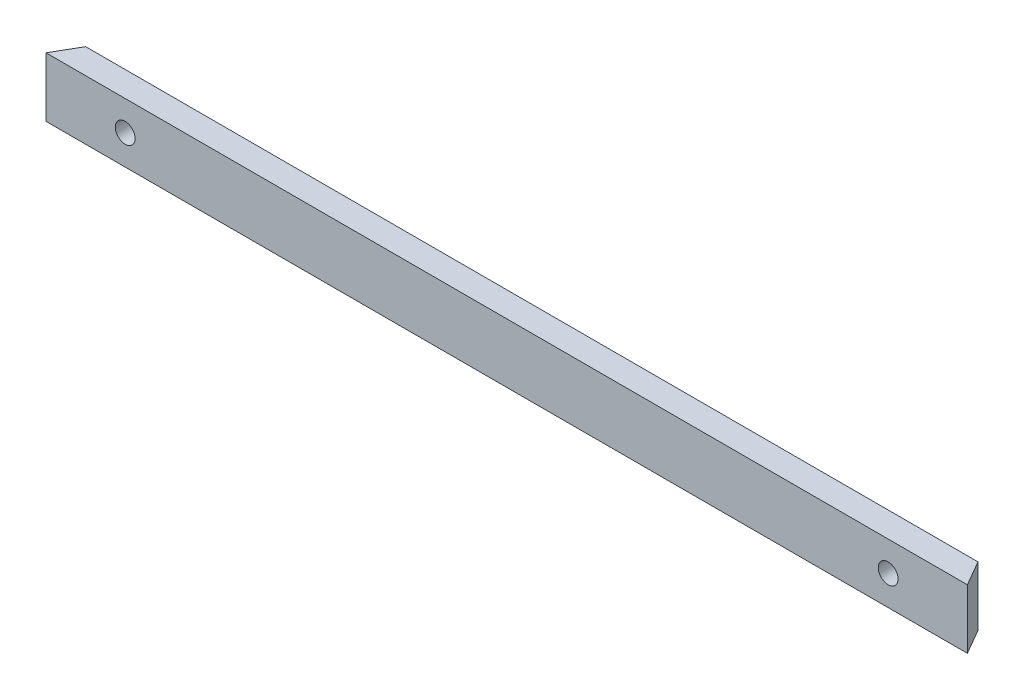
ISO-10303-21;
HEADER;
FILE_DESCRIPTION(('STEP AP214'),'2;1');
FILE_NAME('part.step','',(''),(''),'','','');
FILE_SCHEMA(('AUTOMOTIVE_DESIGN { 1 0 10303 214 1 1 1 1 }'));
ENDSEC;
DATA;
#1=APPLICATION_CONTEXT('core data for automotive mechanical design processes');
#2=APPLICATION_PROTOCOL_DEFINITION('international standard','automotive_design',2000,#1);
#3=PRODUCT_CONTEXT('',#1,'mechanical');
#4=PRODUCT('Part','Part','',(#3));
#5=PRODUCT_RELATED_PRODUCT_CATEGORY('part','',(#4));
#6=PRODUCT_DEFINITION_FORMATION('','',#4);
#7=PRODUCT_DEFINITION_CONTEXT('part definition',#1,'design');
#8=PRODUCT_DEFINITION('design','',#6,#7);
#9=PRODUCT_DEFINITION_SHAPE('','',#8);
#10=(LENGTH_UNIT() NAMED_UNIT(*) SI_UNIT(.MILLI.,.METRE.));
#11=(NAMED_UNIT(*) PLANE_ANGLE_UNIT() SI_UNIT($,.RADIAN.));
#12=(NAMED_UNIT(*) SI_UNIT($,.STERADIAN.) SOLID_ANGLE_UNIT());
#13=UNCERTAINTY_MEASURE_WITH_UNIT(LENGTH_MEASURE(1.E-05),#10,'distance_accuracy_value','');
#14=(GEOMETRIC_REPRESENTATION_CONTEXT(3) GLOBAL_UNCERTAINTY_ASSIGNED_CONTEXT((#13)) GLOBAL_UNIT_ASSIGNED_CONTEXT((#10,
#11,#12)) REPRESENTATION_CONTEXT('',''));
#15=CARTESIAN_POINT('',(0.,0.,0.));
#16=DIRECTION('',(0.,0.,1.));
#17=DIRECTION('',(1.,0.,0.));
#18=AXIS2_PLACEMENT_3D('',#15,#16,#17);
#19=CARTESIAN_POINT('',(0.,15.,-6.35));
#20=DIRECTION('',(0.,-1.,0.));
#21=DIRECTION('',(0.,0.,-1.));
#22=AXIS2_PLACEMENT_3D('',#19,#20,#21);
#23=PLANE('',#22);
#24=DIRECTION('',(1.,0.,0.));
#25=VECTOR('',#24,1.);
#26=CARTESIAN_POINT('',(0.,15.,-6.35));
#27=LINE('',#26,#25);
#28=CARTESIAN_POINT('',(3.6661742093541,15.,-6.35));
#29=VERTEX_POINT('',#28);
#30=CARTESIAN_POINT('',(229.001477390646,15.,-6.35));
#31=VERTEX_POINT('',#30);
#32=EDGE_CURVE('E50',#29,#31,#27,.T.);
#33=ORIENTED_EDGE('',*,*,#32,.F.);
#34=DIRECTION('',(0.499999999999998,0.,-0.86602540378444));
#35=VECTOR('',#34,1.);
#36=CARTESIAN_POINT('',(0.,15.,0.));
#37=LINE('',#36,#35);
#38=CARTESIAN_POINT('',(0.,15.,0.));
#39=VERTEX_POINT('',#38);
#40=EDGE_CURVE('E82',#39,#29,#37,.T.);
#41=ORIENTED_EDGE('',*,*,#40,.F.);
#42=DIRECTION('',(1.,0.,0.));
#43=VECTOR('',#42,1.);
#44=CARTESIAN_POINT('',(0.,15.,0.));
#45=LINE('',#44,#43);
#46=CARTESIAN_POINT('',(232.6676516,15.,0.));
#47=VERTEX_POINT('',#46);
#48=EDGE_CURVE('E105',#39,#47,#45,.T.);
#49=ORIENTED_EDGE('',*,*,#48,.T.);
#50=DIRECTION('',(0.499999999999996,0.,0.866025403784441));
#51=VECTOR('',#50,1.);
#52=CARTESIAN_POINT('',(232.6676516,15.,0.));
#53=LINE('',#52,#51);
#54=EDGE_CURVE('E66',#31,#47,#53,.T.);
#55=ORIENTED_EDGE('',*,*,#54,.F.);
#56=EDGE_LOOP('',(#33,#41,#49,#55));
#57=FACE_BOUND('',#56,.T.);
#58=ADVANCED_FACE('F42',(#57),#23,.F.);
#59=CARTESIAN_POINT('',(0.,0.,-6.35));
#60=DIRECTION('',(0.,-1.,0.));
#61=DIRECTION('',(0.,0.,-1.));
#62=AXIS2_PLACEMENT_3D('',#59,#60,#61);
#63=PLANE('',#62);
#64=DIRECTION('',(0.499999999999998,0.,-0.86602540378444));
#65=VECTOR('',#64,1.);
#66=CARTESIAN_POINT('',(0.,0.,0.));
#67=LINE('',#66,#65);
#68=CARTESIAN_POINT('',(0.,0.,0.));
#69=VERTEX_POINT('',#68);
#70=CARTESIAN_POINT('',(3.6661742093541,0.,-6.35));
#71=VERTEX_POINT('',#70);
#72=EDGE_CURVE('E58',#69,#71,#67,.T.);
#73=ORIENTED_EDGE('',*,*,#72,.T.);
#74=DIRECTION('',(1.,0.,0.));
#75=VECTOR('',#74,1.);
#76=CARTESIAN_POINT('',(0.,0.,-6.35));
#77=LINE('',#76,#75);
#78=CARTESIAN_POINT('',(229.001477390646,0.,-6.35));
#79=VERTEX_POINT('',#78);
#80=EDGE_CURVE('E11',#71,#79,#77,.T.);
#81=ORIENTED_EDGE('',*,*,#80,.T.);
#82=DIRECTION('',(0.499999999999996,0.,0.866025403784441));
#83=VECTOR('',#82,1.);
#84=CARTESIAN_POINT('',(232.6676516,0.,0.));
#85=LINE('',#84,#83);
#86=CARTESIAN_POINT('',(232.6676516,0.,0.));
#87=VERTEX_POINT('',#86);
#88=EDGE_CURVE('E101',#79,#87,#85,.T.);
#89=ORIENTED_EDGE('',*,*,#88,.T.);
#90=DIRECTION('',(1.,0.,0.));
#91=VECTOR('',#90,1.);
#92=CARTESIAN_POINT('',(0.,0.,0.));
#93=LINE('',#92,#91);
#94=EDGE_CURVE('E45',#69,#87,#93,.T.);
#95=ORIENTED_EDGE('',*,*,#94,.F.);
#96=EDGE_LOOP('',(#73,#81,#89,#95));
#97=FACE_BOUND('',#96,.T.);
#98=ADVANCED_FACE('F113',(#97),#63,.T.);
#99=CARTESIAN_POINT('',(0.,0.,-6.35));
#100=DIRECTION('',(0.,0.,-1.));
#101=DIRECTION('',(-1.,0.,0.));
#102=AXIS2_PLACEMENT_3D('',#99,#100,#101);
#103=PLANE('',#102);
#104=CARTESIAN_POINT('',(20.,7.5,-6.35));
#105=DIRECTION('',(0.,0.,1.));
#106=DIRECTION('',(1.,0.,0.));
#107=AXIS2_PLACEMENT_3D('',#104,#105,#106);
#108=CIRCLE('',#107,2.5);
#109=CARTESIAN_POINT('',(22.5,7.5,-6.35));
#110=VERTEX_POINT('',#109);
#111=EDGE_CURVE('E115',#110,#110,#108,.T.);
#112=ORIENTED_EDGE('',*,*,#111,.T.);
#113=EDGE_LOOP('',(#112));
#114=FACE_BOUND('',#113,.T.);
#115=CARTESIAN_POINT('',(212.6676516,7.5,-6.35));
#116=DIRECTION('',(0.,0.,1.));
#117=DIRECTION('',(1.,0.,0.));
#118=AXIS2_PLACEMENT_3D('',#115,#116,#117);
#119=CIRCLE('',#118,2.5);
#120=CARTESIAN_POINT('',(215.1676516,7.5,-6.35));
#121=VERTEX_POINT('',#120);
#122=EDGE_CURVE('E122',#121,#121,#119,.T.);
#123=ORIENTED_EDGE('',*,*,#122,.T.);
#124=EDGE_LOOP('',(#123));
#125=FACE_BOUND('',#124,.T.);
#126=DIRECTION('',(0.,1.,0.));
#127=VECTOR('',#126,1.);
#128=CARTESIAN_POINT('',(3.6661742093541,0.,-6.35));
#129=LINE('',#128,#127);
#130=EDGE_CURVE('E85',#71,#29,#129,.T.);
#131=ORIENTED_EDGE('',*,*,#130,.T.);
#132=ORIENTED_EDGE('',*,*,#32,.T.);
#133=DIRECTION('',(0.,1.,0.));
#134=VECTOR('',#133,1.);
#135=CARTESIAN_POINT('',(229.001477390646,0.,-6.35));
#136=LINE('',#135,#134);
#137=EDGE_CURVE('E114',#79,#31,#136,.T.);
#138=ORIENTED_EDGE('',*,*,#137,.F.);
#139=ORIENTED_EDGE('',*,*,#80,.F.);
#140=EDGE_LOOP('',(#131,#132,#138,#139));
#141=FACE_BOUND('',#140,.T.);
#142=ADVANCED_FACE('F94',(#114,#125,#141),#103,.T.);
#143=CARTESIAN_POINT('',(0.,0.,0.));
#144=DIRECTION('',(0.,0.,-1.));
#145=DIRECTION('',(-1.,0.,0.));
#146=AXIS2_PLACEMENT_3D('',#143,#144,#145);
#147=PLANE('',#146);
#148=CARTESIAN_POINT('',(20.,7.5,0.));
#149=DIRECTION('',(0.,0.,1.));
#150=DIRECTION('',(1.,0.,0.));
#151=AXIS2_PLACEMENT_3D('',#148,#149,#150);
#152=CIRCLE('',#151,2.5);
#153=CARTESIAN_POINT('',(22.5,7.5,0.));
#154=VERTEX_POINT('',#153);
#155=EDGE_CURVE('E118',#154,#154,#152,.T.);
#156=ORIENTED_EDGE('',*,*,#155,.F.);
#157=EDGE_LOOP('',(#156));
#158=FACE_BOUND('',#157,.T.);
#159=CARTESIAN_POINT('',(212.6676516,7.5,0.));
#160=DIRECTION('',(0.,0.,1.));
#161=DIRECTION('',(1.,0.,0.));
#162=AXIS2_PLACEMENT_3D('',#159,#160,#161);
#163=CIRCLE('',#162,2.5);
#164=CARTESIAN_POINT('',(215.1676516,7.5,0.));
#165=VERTEX_POINT('',#164);
#166=EDGE_CURVE('E125',#165,#165,#163,.T.);
#167=ORIENTED_EDGE('',*,*,#166,.F.);
#168=EDGE_LOOP('',(#167));
#169=FACE_BOUND('',#168,.T.);
#170=DIRECTION('',(0.,1.,0.));
#171=VECTOR('',#170,1.);
#172=CARTESIAN_POINT('',(0.,0.,0.));
#173=LINE('',#172,#171);
#174=EDGE_CURVE('E86',#69,#39,#173,.T.);
#175=ORIENTED_EDGE('',*,*,#174,.F.);
#176=ORIENTED_EDGE('',*,*,#94,.T.);
#177=DIRECTION('',(0.,1.,0.));
#178=VECTOR('',#177,1.);
#179=CARTESIAN_POINT('',(232.6676516,0.,0.));
#180=LINE('',#179,#178);
#181=EDGE_CURVE('E99',#87,#47,#180,.T.);
#182=ORIENTED_EDGE('',*,*,#181,.T.);
#183=ORIENTED_EDGE('',*,*,#48,.F.);
#184=EDGE_LOOP('',(#175,#176,#182,#183));
#185=FACE_BOUND('',#184,.T.);
#186=ADVANCED_FACE('F108',(#158,#169,#185),#147,.F.);
#187=CARTESIAN_POINT('',(232.6676516,0.,0.));
#188=DIRECTION('',(-0.866025403784441,0.,0.499999999999996));
#189=DIRECTION('',(0.499999999999996,0.,0.866025403784441));
#190=AXIS2_PLACEMENT_3D('',#187,#188,#189);
#191=PLANE('',#190);
#192=ORIENTED_EDGE('',*,*,#54,.T.);
#193=ORIENTED_EDGE('',*,*,#181,.F.);
#194=ORIENTED_EDGE('',*,*,#88,.F.);
#195=ORIENTED_EDGE('',*,*,#137,.T.);
#196=EDGE_LOOP('',(#192,#193,#194,#195));
#197=FACE_BOUND('',#196,.T.);
#198=ADVANCED_FACE('F111',(#197),#191,.F.);
#199=CARTESIAN_POINT('',(0.,0.,0.));
#200=DIRECTION('',(0.86602540378444,0.,0.499999999999998));
#201=DIRECTION('',(0.499999999999998,0.,-0.86602540378444));
#202=AXIS2_PLACEMENT_3D('',#199,#200,#201);
#203=PLANE('',#202);
#204=ORIENTED_EDGE('',*,*,#40,.T.);
#205=ORIENTED_EDGE('',*,*,#130,.F.);
#206=ORIENTED_EDGE('',*,*,#72,.F.);
#207=ORIENTED_EDGE('',*,*,#174,.T.);
#208=EDGE_LOOP('',(#204,#205,#206,#207));
#209=FACE_BOUND('',#208,.T.);
#210=ADVANCED_FACE('F84',(#209),#203,.F.);
#211=CARTESIAN_POINT('',(212.6676516,7.5,-6.35));
#212=DIRECTION('',(0.,0.,1.));
#213=DIRECTION('',(1.,0.,0.));
#214=AXIS2_PLACEMENT_3D('',#211,#212,#213);
#215=CYLINDRICAL_SURFACE('',#214,2.5);
#216=ORIENTED_EDGE('',*,*,#122,.F.);
#217=EDGE_LOOP('',(#216));
#218=FACE_BOUND('',#217,.T.);
#219=ORIENTED_EDGE('',*,*,#166,.T.);
#220=EDGE_LOOP('',(#219));
#221=FACE_BOUND('',#220,.T.);
#222=ADVANCED_FACE('F138',(#218,#221),#215,.F.);
#223=CARTESIAN_POINT('',(20.,7.5,-6.35));
#224=DIRECTION('',(0.,0.,1.));
#225=DIRECTION('',(1.,0.,0.));
#226=AXIS2_PLACEMENT_3D('',#223,#224,#225);
#227=CYLINDRICAL_SURFACE('',#226,2.5);
#228=ORIENTED_EDGE('',*,*,#111,.F.);
#229=EDGE_LOOP('',(#228));
#230=FACE_BOUND('',#229,.T.);
#231=ORIENTED_EDGE('',*,*,#155,.T.);
#232=EDGE_LOOP('',(#231));
#233=FACE_BOUND('',#232,.T.);
#234=ADVANCED_FACE('F131',(#230,#233),#227,.F.);
#235=CLOSED_SHELL('',(#58,#98,#142,#186,#198,#210,#222,#234));
#236=MANIFOLD_SOLID_BREP('B2',#235);
#237=ADVANCED_BREP_SHAPE_REPRESENTATION('',(#18,#236),#14);
#238=SHAPE_DEFINITION_REPRESENTATION(#9,#237);
ENDSEC;
END-ISO-10303-21;
